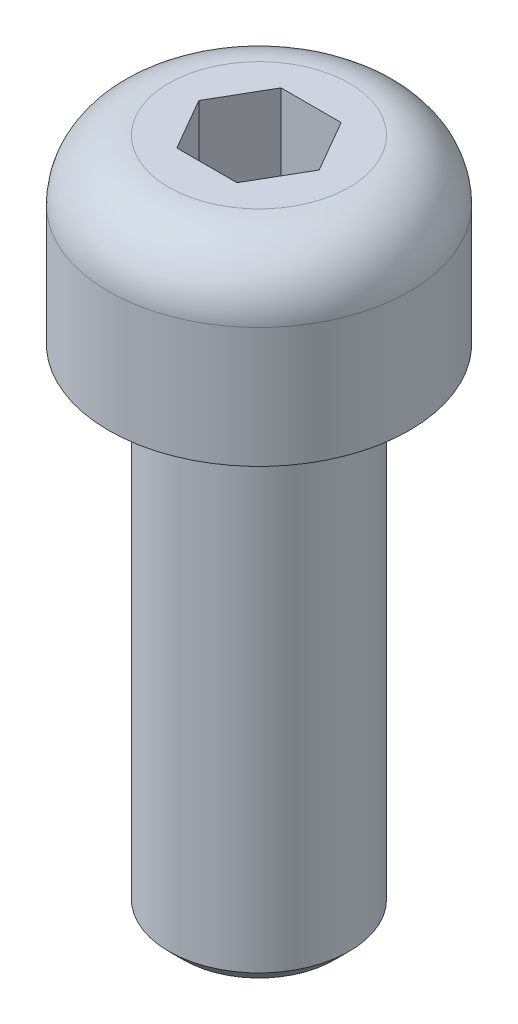
ISO-10303-21;
HEADER;
FILE_DESCRIPTION(('STEP AP214'),'2;1');
FILE_NAME('part.step','',(''),(''),'','','');
FILE_SCHEMA(('AUTOMOTIVE_DESIGN { 1 0 10303 214 1 1 1 1 }'));
ENDSEC;
DATA;
#1=APPLICATION_CONTEXT('core data for automotive mechanical design processes');
#2=APPLICATION_PROTOCOL_DEFINITION('international standard','automotive_design',2000,#1);
#3=PRODUCT_CONTEXT('',#1,'mechanical');
#4=PRODUCT('Part','Part','',(#3));
#5=PRODUCT_RELATED_PRODUCT_CATEGORY('part','',(#4));
#6=PRODUCT_DEFINITION_FORMATION('','',#4);
#7=PRODUCT_DEFINITION_CONTEXT('part definition',#1,'design');
#8=PRODUCT_DEFINITION('design','',#6,#7);
#9=PRODUCT_DEFINITION_SHAPE('','',#8);
#10=(LENGTH_UNIT() NAMED_UNIT(*) SI_UNIT(.MILLI.,.METRE.));
#11=(NAMED_UNIT(*) PLANE_ANGLE_UNIT() SI_UNIT($,.RADIAN.));
#12=(NAMED_UNIT(*) SI_UNIT($,.STERADIAN.) SOLID_ANGLE_UNIT());
#13=UNCERTAINTY_MEASURE_WITH_UNIT(LENGTH_MEASURE(1.E-05),#10,'distance_accuracy_value','');
#14=(GEOMETRIC_REPRESENTATION_CONTEXT(3) GLOBAL_UNCERTAINTY_ASSIGNED_CONTEXT((#13)) GLOBAL_UNIT_ASSIGNED_CONTEXT((#10,
#11,#12)) REPRESENTATION_CONTEXT('',''));
#15=CARTESIAN_POINT('',(0.,0.,0.));
#16=DIRECTION('',(0.,0.,1.));
#17=DIRECTION('',(1.,0.,0.));
#18=AXIS2_PLACEMENT_3D('',#15,#16,#17);
#19=CARTESIAN_POINT('',(0.,8.25,0.));
#20=DIRECTION('',(0.,-1.,0.));
#21=DIRECTION('',(0.,0.,-1.));
#22=AXIS2_PLACEMENT_3D('',#19,#20,#21);
#23=CYLINDRICAL_SURFACE('',#22,1.5);
#24=CARTESIAN_POINT('',(0.,0.250000000000002,0.));
#25=DIRECTION('',(0.,1.,0.));
#26=DIRECTION('',(0.,0.,1.));
#27=AXIS2_PLACEMENT_3D('',#24,#25,#26);
#28=CIRCLE('',#27,1.5);
#29=CARTESIAN_POINT('',(0.,0.250000000000002,1.5));
#30=VERTEX_POINT('',#29);
#31=EDGE_CURVE('E49',#30,#30,#28,.T.);
#32=ORIENTED_EDGE('',*,*,#31,.T.);
#33=EDGE_LOOP('',(#32));
#34=FACE_BOUND('',#33,.T.);
#35=CARTESIAN_POINT('',(0.,8.25,0.));
#36=DIRECTION('',(0.,1.,0.));
#37=DIRECTION('',(0.,0.,1.));
#38=AXIS2_PLACEMENT_3D('',#35,#36,#37);
#39=CIRCLE('',#38,1.5);
#40=CARTESIAN_POINT('',(0.,8.25,1.5));
#41=VERTEX_POINT('',#40);
#42=EDGE_CURVE('E151',#41,#41,#39,.T.);
#43=ORIENTED_EDGE('',*,*,#42,.F.);
#44=EDGE_LOOP('',(#43));
#45=FACE_BOUND('',#44,.T.);
#46=ADVANCED_FACE('F41',(#34,#45),#23,.T.);
#47=CARTESIAN_POINT('',(0.,0.,0.));
#48=DIRECTION('',(0.,1.,0.));
#49=DIRECTION('',(0.,0.,1.));
#50=AXIS2_PLACEMENT_3D('',#47,#48,#49);
#51=PLANE('',#50);
#52=CARTESIAN_POINT('',(0.,0.,0.));
#53=DIRECTION('',(0.,1.,0.));
#54=DIRECTION('',(0.,0.,1.));
#55=AXIS2_PLACEMENT_3D('',#52,#53,#54);
#56=CIRCLE('',#55,1.25);
#57=CARTESIAN_POINT('',(0.,0.,1.25));
#58=VERTEX_POINT('',#57);
#59=EDGE_CURVE('E11',#58,#58,#56,.F.);
#60=ORIENTED_EDGE('',*,*,#59,.T.);
#61=EDGE_LOOP('',(#60));
#62=FACE_BOUND('',#61,.T.);
#63=ADVANCED_FACE('F180',(#62),#51,.F.);
#64=CARTESIAN_POINT('',(0.,11.25,0.));
#65=DIRECTION('',(0.,-1.,0.));
#66=DIRECTION('',(0.,0.,-1.));
#67=AXIS2_PLACEMENT_3D('',#64,#65,#66);
#68=CYLINDRICAL_SURFACE('',#67,2.5);
#69=CARTESIAN_POINT('',(0.,10.25,0.));
#70=DIRECTION('',(0.,1.,0.));
#71=DIRECTION('',(0.,0.,1.));
#72=AXIS2_PLACEMENT_3D('',#69,#70,#71);
#73=CIRCLE('',#72,2.5);
#74=CARTESIAN_POINT('',(0.,10.25,2.5));
#75=VERTEX_POINT('',#74);
#76=EDGE_CURVE('E157',#75,#75,#73,.F.);
#77=ORIENTED_EDGE('',*,*,#76,.T.);
#78=EDGE_LOOP('',(#77));
#79=FACE_BOUND('',#78,.T.);
#80=CARTESIAN_POINT('',(0.,8.25,0.));
#81=DIRECTION('',(0.,1.,0.));
#82=DIRECTION('',(0.,0.,1.));
#83=AXIS2_PLACEMENT_3D('',#80,#81,#82);
#84=CIRCLE('',#83,2.5);
#85=CARTESIAN_POINT('',(0.,8.25,2.5));
#86=VERTEX_POINT('',#85);
#87=EDGE_CURVE('E143',#86,#86,#84,.T.);
#88=ORIENTED_EDGE('',*,*,#87,.T.);
#89=EDGE_LOOP('',(#88));
#90=FACE_BOUND('',#89,.T.);
#91=ADVANCED_FACE('F184',(#79,#90),#68,.T.);
#92=CARTESIAN_POINT('',(0.,11.25,0.));
#93=DIRECTION('',(0.,1.,0.));
#94=DIRECTION('',(0.,0.,1.));
#95=AXIS2_PLACEMENT_3D('',#92,#93,#94);
#96=PLANE('',#95);
#97=DIRECTION('',(-0.499999999999999,0.,0.866025403784439));
#98=VECTOR('',#97,1.);
#99=CARTESIAN_POINT('',(-0.5,11.25,-0.866025403784439));
#100=LINE('',#99,#98);
#101=CARTESIAN_POINT('',(-0.5,11.25,-0.866025403784439));
#102=VERTEX_POINT('',#101);
#103=CARTESIAN_POINT('',(-1.,11.25,0.));
#104=VERTEX_POINT('',#103);
#105=EDGE_CURVE('E56',#102,#104,#100,.T.);
#106=ORIENTED_EDGE('',*,*,#105,.F.);
#107=DIRECTION('',(-1.,0.,0.));
#108=VECTOR('',#107,1.);
#109=CARTESIAN_POINT('',(0.5,11.25,-0.866025403784439));
#110=LINE('',#109,#108);
#111=CARTESIAN_POINT('',(0.5,11.25,-0.866025403784439));
#112=VERTEX_POINT('',#111);
#113=EDGE_CURVE('E139',#112,#102,#110,.T.);
#114=ORIENTED_EDGE('',*,*,#113,.F.);
#115=DIRECTION('',(-0.5,0.,-0.866025403784439));
#116=VECTOR('',#115,1.);
#117=CARTESIAN_POINT('',(1.,11.25,0.));
#118=LINE('',#117,#116);
#119=CARTESIAN_POINT('',(1.,11.25,0.));
#120=VERTEX_POINT('',#119);
#121=EDGE_CURVE('E137',#120,#112,#118,.T.);
#122=ORIENTED_EDGE('',*,*,#121,.F.);
#123=DIRECTION('',(0.5,0.,-0.866025403784439));
#124=VECTOR('',#123,1.);
#125=CARTESIAN_POINT('',(0.5,11.25,0.866025403784439));
#126=LINE('',#125,#124);
#127=CARTESIAN_POINT('',(0.5,11.25,0.866025403784439));
#128=VERTEX_POINT('',#127);
#129=EDGE_CURVE('E104',#128,#120,#126,.T.);
#130=ORIENTED_EDGE('',*,*,#129,.F.);
#131=DIRECTION('',(1.,0.,0.));
#132=VECTOR('',#131,1.);
#133=CARTESIAN_POINT('',(-0.5,11.25,0.866025403784439));
#134=LINE('',#133,#132);
#135=CARTESIAN_POINT('',(-0.5,11.25,0.866025403784439));
#136=VERTEX_POINT('',#135);
#137=EDGE_CURVE('E133',#136,#128,#134,.T.);
#138=ORIENTED_EDGE('',*,*,#137,.F.);
#139=DIRECTION('',(0.5,0.,0.866025403784439));
#140=VECTOR('',#139,1.);
#141=CARTESIAN_POINT('',(-1.,11.25,0.));
#142=LINE('',#141,#140);
#143=EDGE_CURVE('E130',#104,#136,#142,.T.);
#144=ORIENTED_EDGE('',*,*,#143,.F.);
#145=EDGE_LOOP('',(#106,#114,#122,#130,#138,#144));
#146=FACE_BOUND('',#145,.T.);
#147=CARTESIAN_POINT('',(0.,11.25,0.));
#148=DIRECTION('',(0.,1.,0.));
#149=DIRECTION('',(0.,0.,1.));
#150=AXIS2_PLACEMENT_3D('',#147,#148,#149);
#151=CIRCLE('',#150,1.5);
#152=CARTESIAN_POINT('',(0.,11.25,1.5));
#153=VERTEX_POINT('',#152);
#154=EDGE_CURVE('E154',#153,#153,#151,.T.);
#155=ORIENTED_EDGE('',*,*,#154,.T.);
#156=EDGE_LOOP('',(#155));
#157=FACE_BOUND('',#156,.T.);
#158=ADVANCED_FACE('F190',(#146,#157),#96,.T.);
#159=CARTESIAN_POINT('',(0.,8.25,0.));
#160=DIRECTION('',(0.,1.,0.));
#161=DIRECTION('',(0.,0.,1.));
#162=AXIS2_PLACEMENT_3D('',#159,#160,#161);
#163=PLANE('',#162);
#164=ORIENTED_EDGE('',*,*,#42,.T.);
#165=EDGE_LOOP('',(#164));
#166=FACE_BOUND('',#165,.T.);
#167=ORIENTED_EDGE('',*,*,#87,.F.);
#168=EDGE_LOOP('',(#167));
#169=FACE_BOUND('',#168,.T.);
#170=ADVANCED_FACE('F176',(#166,#169),#163,.F.);
#171=CARTESIAN_POINT('',(0.,10.25,0.));
#172=DIRECTION('',(0.,1.,0.));
#173=DIRECTION('',(0.,0.,1.));
#174=AXIS2_PLACEMENT_3D('',#171,#172,#173);
#175=TOROIDAL_SURFACE('',#174,1.5,1.);
#176=ORIENTED_EDGE('',*,*,#76,.F.);
#177=EDGE_LOOP('',(#176));
#178=FACE_BOUND('',#177,.T.);
#179=ORIENTED_EDGE('',*,*,#154,.F.);
#180=EDGE_LOOP('',(#179));
#181=FACE_BOUND('',#180,.T.);
#182=ADVANCED_FACE('F166',(#178,#181),#175,.T.);
#183=CARTESIAN_POINT('',(0.,0.250000000000002,0.));
#184=DIRECTION('',(0.,1.,0.));
#185=DIRECTION('',(0.,0.,1.));
#186=AXIS2_PLACEMENT_3D('',#183,#184,#185);
#187=CONICAL_SURFACE('',#186,1.5,0.785398163397449);
#188=ORIENTED_EDGE('',*,*,#59,.F.);
#189=EDGE_LOOP('',(#188));
#190=FACE_BOUND('',#189,.T.);
#191=ORIENTED_EDGE('',*,*,#31,.F.);
#192=EDGE_LOOP('',(#191));
#193=FACE_BOUND('',#192,.T.);
#194=ADVANCED_FACE('F43',(#190,#193),#187,.T.);
#195=CARTESIAN_POINT('',(-0.5,9.25,-0.866025403784439));
#196=DIRECTION('',(-0.866025403784439,0.,-0.499999999999999));
#197=DIRECTION('',(-0.5,0.,0.866025403784439));
#198=AXIS2_PLACEMENT_3D('',#195,#196,#197);
#199=PLANE('',#198);
#200=ORIENTED_EDGE('',*,*,#105,.T.);
#201=DIRECTION('',(0.,1.,0.));
#202=VECTOR('',#201,1.);
#203=CARTESIAN_POINT('',(-1.,9.25,0.));
#204=LINE('',#203,#202);
#205=CARTESIAN_POINT('',(-1.,9.25,0.));
#206=VERTEX_POINT('',#205);
#207=EDGE_CURVE('E86',#206,#104,#204,.T.);
#208=ORIENTED_EDGE('',*,*,#207,.F.);
#209=DIRECTION('',(-0.499999999999999,0.,0.866025403784439));
#210=VECTOR('',#209,1.);
#211=CARTESIAN_POINT('',(-0.5,9.25,-0.866025403784439));
#212=LINE('',#211,#210);
#213=CARTESIAN_POINT('',(-0.5,9.25,-0.866025403784439));
#214=VERTEX_POINT('',#213);
#215=EDGE_CURVE('E141',#214,#206,#212,.T.);
#216=ORIENTED_EDGE('',*,*,#215,.F.);
#217=DIRECTION('',(0.,1.,0.));
#218=VECTOR('',#217,1.);
#219=CARTESIAN_POINT('',(-0.5,9.25,-0.866025403784439));
#220=LINE('',#219,#218);
#221=EDGE_CURVE('E64',#214,#102,#220,.T.);
#222=ORIENTED_EDGE('',*,*,#221,.T.);
#223=EDGE_LOOP('',(#200,#208,#216,#222));
#224=FACE_BOUND('',#223,.T.);
#225=ADVANCED_FACE('F165',(#224),#199,.F.);
#226=CARTESIAN_POINT('',(0.5,9.25,-0.866025403784439));
#227=DIRECTION('',(0.,0.,-1.));
#228=DIRECTION('',(-1.,0.,0.));
#229=AXIS2_PLACEMENT_3D('',#226,#227,#228);
#230=PLANE('',#229);
#231=ORIENTED_EDGE('',*,*,#113,.T.);
#232=ORIENTED_EDGE('',*,*,#221,.F.);
#233=DIRECTION('',(-1.,0.,0.));
#234=VECTOR('',#233,1.);
#235=CARTESIAN_POINT('',(0.5,9.25,-0.866025403784439));
#236=LINE('',#235,#234);
#237=CARTESIAN_POINT('',(0.5,9.25,-0.866025403784439));
#238=VERTEX_POINT('',#237);
#239=EDGE_CURVE('E116',#238,#214,#236,.T.);
#240=ORIENTED_EDGE('',*,*,#239,.F.);
#241=DIRECTION('',(0.,1.,0.));
#242=VECTOR('',#241,1.);
#243=CARTESIAN_POINT('',(0.5,9.25,-0.866025403784439));
#244=LINE('',#243,#242);
#245=EDGE_CURVE('E108',#238,#112,#244,.T.);
#246=ORIENTED_EDGE('',*,*,#245,.T.);
#247=EDGE_LOOP('',(#231,#232,#240,#246));
#248=FACE_BOUND('',#247,.T.);
#249=ADVANCED_FACE('F173',(#248),#230,.F.);
#250=CARTESIAN_POINT('',(1.,9.25,0.));
#251=DIRECTION('',(0.866025403784439,0.,-0.5));
#252=DIRECTION('',(-0.5,0.,-0.866025403784439));
#253=AXIS2_PLACEMENT_3D('',#250,#251,#252);
#254=PLANE('',#253);
#255=ORIENTED_EDGE('',*,*,#121,.T.);
#256=ORIENTED_EDGE('',*,*,#245,.F.);
#257=DIRECTION('',(-0.5,0.,-0.866025403784439));
#258=VECTOR('',#257,1.);
#259=CARTESIAN_POINT('',(1.,9.25,0.));
#260=LINE('',#259,#258);
#261=CARTESIAN_POINT('',(1.,9.25,0.));
#262=VERTEX_POINT('',#261);
#263=EDGE_CURVE('E112',#262,#238,#260,.T.);
#264=ORIENTED_EDGE('',*,*,#263,.F.);
#265=DIRECTION('',(0.,1.,0.));
#266=VECTOR('',#265,1.);
#267=CARTESIAN_POINT('',(1.,9.25,0.));
#268=LINE('',#267,#266);
#269=EDGE_CURVE('E97',#262,#120,#268,.T.);
#270=ORIENTED_EDGE('',*,*,#269,.T.);
#271=EDGE_LOOP('',(#255,#256,#264,#270));
#272=FACE_BOUND('',#271,.T.);
#273=ADVANCED_FACE('F113',(#272),#254,.F.);
#274=CARTESIAN_POINT('',(0.5,9.25,0.866025403784439));
#275=DIRECTION('',(0.866025403784439,0.,0.5));
#276=DIRECTION('',(0.5,0.,-0.866025403784439));
#277=AXIS2_PLACEMENT_3D('',#274,#275,#276);
#278=PLANE('',#277);
#279=ORIENTED_EDGE('',*,*,#129,.T.);
#280=ORIENTED_EDGE('',*,*,#269,.F.);
#281=DIRECTION('',(0.5,0.,-0.866025403784439));
#282=VECTOR('',#281,1.);
#283=CARTESIAN_POINT('',(0.5,9.25,0.866025403784439));
#284=LINE('',#283,#282);
#285=CARTESIAN_POINT('',(0.5,9.25,0.866025403784439));
#286=VERTEX_POINT('',#285);
#287=EDGE_CURVE('E101',#286,#262,#284,.T.);
#288=ORIENTED_EDGE('',*,*,#287,.F.);
#289=DIRECTION('',(0.,1.,0.));
#290=VECTOR('',#289,1.);
#291=CARTESIAN_POINT('',(0.5,9.25,0.866025403784439));
#292=LINE('',#291,#290);
#293=EDGE_CURVE('E109',#286,#128,#292,.T.);
#294=ORIENTED_EDGE('',*,*,#293,.T.);
#295=EDGE_LOOP('',(#279,#280,#288,#294));
#296=FACE_BOUND('',#295,.T.);
#297=ADVANCED_FACE('F99',(#296),#278,.F.);
#298=CARTESIAN_POINT('',(-0.5,9.25,0.866025403784439));
#299=DIRECTION('',(0.,0.,1.));
#300=DIRECTION('',(1.,0.,0.));
#301=AXIS2_PLACEMENT_3D('',#298,#299,#300);
#302=PLANE('',#301);
#303=ORIENTED_EDGE('',*,*,#137,.T.);
#304=ORIENTED_EDGE('',*,*,#293,.F.);
#305=DIRECTION('',(1.,0.,0.));
#306=VECTOR('',#305,1.);
#307=CARTESIAN_POINT('',(-0.5,9.25,0.866025403784439));
#308=LINE('',#307,#306);
#309=CARTESIAN_POINT('',(-0.5,9.25,0.866025403784439));
#310=VERTEX_POINT('',#309);
#311=EDGE_CURVE('E122',#310,#286,#308,.T.);
#312=ORIENTED_EDGE('',*,*,#311,.F.);
#313=DIRECTION('',(0.,1.,0.));
#314=VECTOR('',#313,1.);
#315=CARTESIAN_POINT('',(-0.5,9.25,0.866025403784439));
#316=LINE('',#315,#314);
#317=EDGE_CURVE('E146',#310,#136,#316,.T.);
#318=ORIENTED_EDGE('',*,*,#317,.T.);
#319=EDGE_LOOP('',(#303,#304,#312,#318));
#320=FACE_BOUND('',#319,.T.);
#321=ADVANCED_FACE('F200',(#320),#302,.F.);
#322=CARTESIAN_POINT('',(-1.,9.25,0.));
#323=DIRECTION('',(-0.866025403784439,0.,0.5));
#324=DIRECTION('',(0.5,0.,0.866025403784439));
#325=AXIS2_PLACEMENT_3D('',#322,#323,#324);
#326=PLANE('',#325);
#327=ORIENTED_EDGE('',*,*,#143,.T.);
#328=ORIENTED_EDGE('',*,*,#317,.F.);
#329=DIRECTION('',(0.5,0.,0.866025403784439));
#330=VECTOR('',#329,1.);
#331=CARTESIAN_POINT('',(-1.,9.25,0.));
#332=LINE('',#331,#330);
#333=EDGE_CURVE('E124',#206,#310,#332,.T.);
#334=ORIENTED_EDGE('',*,*,#333,.F.);
#335=ORIENTED_EDGE('',*,*,#207,.T.);
#336=EDGE_LOOP('',(#327,#328,#334,#335));
#337=FACE_BOUND('',#336,.T.);
#338=ADVANCED_FACE('F197',(#337),#326,.F.);
#339=CARTESIAN_POINT('',(0.,9.25,0.));
#340=DIRECTION('',(0.,1.,0.));
#341=DIRECTION('',(0.,0.,1.));
#342=AXIS2_PLACEMENT_3D('',#339,#340,#341);
#343=PLANE('',#342);
#344=ORIENTED_EDGE('',*,*,#215,.T.);
#345=ORIENTED_EDGE('',*,*,#333,.T.);
#346=ORIENTED_EDGE('',*,*,#311,.T.);
#347=ORIENTED_EDGE('',*,*,#287,.T.);
#348=ORIENTED_EDGE('',*,*,#263,.T.);
#349=ORIENTED_EDGE('',*,*,#239,.T.);
#350=EDGE_LOOP('',(#344,#345,#346,#347,#348,#349));
#351=FACE_BOUND('',#350,.T.);
#352=ADVANCED_FACE('F119',(#351),#343,.T.);
#353=CLOSED_SHELL('',(#46,#63,#91,#158,#170,#182,#194,#225,#249,#273,#297,#321,#338,#352));
#354=MANIFOLD_SOLID_BREP('B2',#353);
#355=ADVANCED_BREP_SHAPE_REPRESENTATION('',(#18,#354),#14);
#356=SHAPE_DEFINITION_REPRESENTATION(#9,#355);
ENDSEC;
END-ISO-10303-21;
